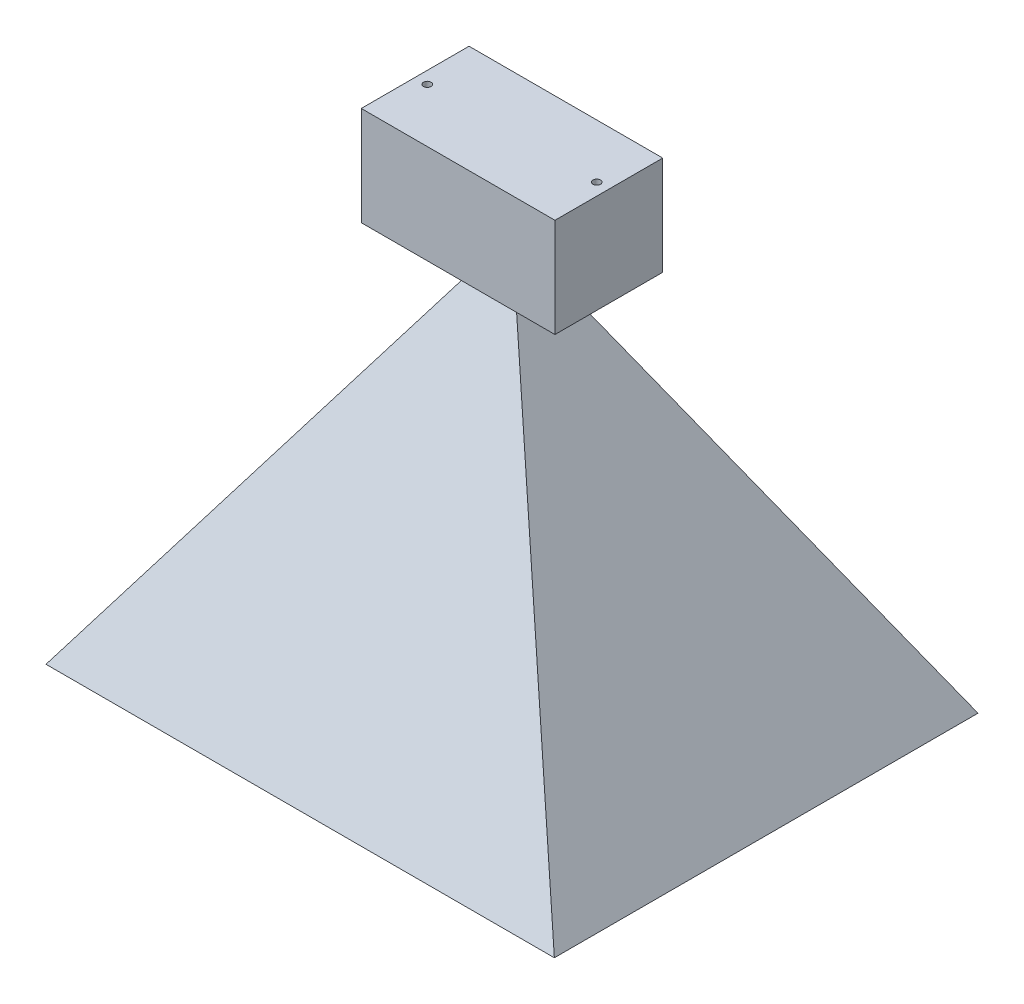
ISO-10303-21;
HEADER;
FILE_DESCRIPTION(('STEP AP214'),'2;1');
FILE_NAME('part.step','',(''),(''),'','','');
FILE_SCHEMA(('AUTOMOTIVE_DESIGN { 1 0 10303 214 1 1 1 1 }'));
ENDSEC;
DATA;
#1=APPLICATION_CONTEXT('core data for automotive mechanical design processes');
#2=APPLICATION_PROTOCOL_DEFINITION('international standard','automotive_design',2000,#1);
#3=PRODUCT_CONTEXT('',#1,'mechanical');
#4=PRODUCT('Part','Part','',(#3));
#5=PRODUCT_RELATED_PRODUCT_CATEGORY('part','',(#4));
#6=PRODUCT_DEFINITION_FORMATION('','',#4);
#7=PRODUCT_DEFINITION_CONTEXT('part definition',#1,'design');
#8=PRODUCT_DEFINITION('design','',#6,#7);
#9=PRODUCT_DEFINITION_SHAPE('','',#8);
#10=(LENGTH_UNIT() NAMED_UNIT(*) SI_UNIT(.MILLI.,.METRE.));
#11=(NAMED_UNIT(*) PLANE_ANGLE_UNIT() SI_UNIT($,.RADIAN.));
#12=(NAMED_UNIT(*) SI_UNIT($,.STERADIAN.) SOLID_ANGLE_UNIT());
#13=UNCERTAINTY_MEASURE_WITH_UNIT(LENGTH_MEASURE(1.E-05),#10,'distance_accuracy_value','');
#14=(GEOMETRIC_REPRESENTATION_CONTEXT(3) GLOBAL_UNCERTAINTY_ASSIGNED_CONTEXT((#13)) GLOBAL_UNIT_ASSIGNED_CONTEXT((#10,
#11,#12)) REPRESENTATION_CONTEXT('',''));
#15=CARTESIAN_POINT('',(0.,0.,0.));
#16=DIRECTION('',(0.,0.,1.));
#17=DIRECTION('',(1.,0.,0.));
#18=AXIS2_PLACEMENT_3D('',#15,#16,#17);
#19=CARTESIAN_POINT('',(0.,0.,0.));
#20=DIRECTION('',(0.,-1.,0.));
#21=DIRECTION('',(0.,0.,-1.));
#22=AXIS2_PLACEMENT_3D('',#19,#20,#21);
#23=PLANE('',#22);
#24=DIRECTION('',(0.,0.,-1.));
#25=VECTOR('',#24,1.);
#26=CARTESIAN_POINT('',(76.2000000000001,0.,63.5));
#27=LINE('',#26,#25);
#28=CARTESIAN_POINT('',(76.2000000000001,0.,63.5));
#29=VERTEX_POINT('',#28);
#30=CARTESIAN_POINT('',(76.2000000000001,0.,-63.5));
#31=VERTEX_POINT('',#30);
#32=EDGE_CURVE('E92',#29,#31,#27,.T.);
#33=ORIENTED_EDGE('',*,*,#32,.F.);
#34=DIRECTION('',(1.,0.,0.));
#35=VECTOR('',#34,1.);
#36=CARTESIAN_POINT('',(-76.1999999999999,0.,63.5));
#37=LINE('',#36,#35);
#38=CARTESIAN_POINT('',(-76.1999999999999,0.,63.5));
#39=VERTEX_POINT('',#38);
#40=EDGE_CURVE('E86',#39,#29,#37,.T.);
#41=ORIENTED_EDGE('',*,*,#40,.F.);
#42=DIRECTION('',(0.,0.,1.));
#43=VECTOR('',#42,1.);
#44=CARTESIAN_POINT('',(-76.1999999999999,0.,63.5));
#45=LINE('',#44,#43);
#46=CARTESIAN_POINT('',(-76.1999999999999,0.,-63.5));
#47=VERTEX_POINT('',#46);
#48=EDGE_CURVE('E103',#47,#39,#45,.T.);
#49=ORIENTED_EDGE('',*,*,#48,.F.);
#50=DIRECTION('',(-1.,0.,0.));
#51=VECTOR('',#50,1.);
#52=CARTESIAN_POINT('',(-76.1999999999999,0.,-63.5));
#53=LINE('',#52,#51);
#54=EDGE_CURVE('E109',#31,#47,#53,.T.);
#55=ORIENTED_EDGE('',*,*,#54,.F.);
#56=EDGE_LOOP('',(#33,#41,#49,#55));
#57=FACE_BOUND('',#56,.T.);
#58=ADVANCED_FACE('F45',(#57),#23,.T.);
#59=CARTESIAN_POINT('',(-53.811142369564,34.7097969663219,0.));
#60=DIRECTION('',(-0.840346934741353,0.542048917784007,0.));
#61=DIRECTION('',(-0.542048917784007,-0.840346934741353,0.));
#62=AXIS2_PLACEMENT_3D('',#59,#60,#61);
#63=PLANE('',#62);
#64=DIRECTION('',(-0.493989929674284,-0.765840332071832,-0.41165827472857));
#65=VECTOR('',#64,1.);
#66=CARTESIAN_POINT('',(-2.47307991337973,114.3,-2.06089992781642));
#67=LINE('',#66,#65);
#68=CARTESIAN_POINT('',(-2.47307991337973,114.3,-2.06089992781642));
#69=VERTEX_POINT('',#68);
#70=EDGE_CURVE('E163',#69,#47,#67,.T.);
#71=ORIENTED_EDGE('',*,*,#70,.T.);
#72=ORIENTED_EDGE('',*,*,#48,.T.);
#73=DIRECTION('',(-0.493989929674284,-0.765840332071832,0.41165827472857));
#74=VECTOR('',#73,1.);
#75=CARTESIAN_POINT('',(-2.47307991337973,114.3,2.06089992781653));
#76=LINE('',#75,#74);
#77=CARTESIAN_POINT('',(-2.47307991337973,114.3,2.06089992781653));
#78=VERTEX_POINT('',#77);
#79=EDGE_CURVE('E102',#78,#39,#76,.T.);
#80=ORIENTED_EDGE('',*,*,#79,.F.);
#81=DIRECTION('',(0.,0.,1.));
#82=VECTOR('',#81,1.);
#83=CARTESIAN_POINT('',(-2.47307991337973,114.3,2.06089992781653));
#84=LINE('',#83,#82);
#85=EDGE_CURVE('E56',#69,#78,#84,.T.);
#86=ORIENTED_EDGE('',*,*,#85,.F.);
#87=EDGE_LOOP('',(#71,#72,#80,#86));
#88=FACE_BOUND('',#87,.T.);
#89=ADVANCED_FACE('F167',(#88),#63,.T.);
#90=CARTESIAN_POINT('',(0.,26.4814632698211,49.2655531767945));
#91=DIRECTION('',(0.,0.473460153445751,0.880815237776417));
#92=DIRECTION('',(0.,-0.880815237776417,0.473460153445751));
#93=AXIS2_PLACEMENT_3D('',#90,#91,#92);
#94=PLANE('',#93);
#95=ORIENTED_EDGE('',*,*,#79,.T.);
#96=ORIENTED_EDGE('',*,*,#40,.T.);
#97=DIRECTION('',(0.493989929674284,-0.765840332071832,0.411658274728569));
#98=VECTOR('',#97,1.);
#99=CARTESIAN_POINT('',(2.47307991337981,114.3,2.06089992781653));
#100=LINE('',#99,#98);
#101=CARTESIAN_POINT('',(2.47307991337981,114.3,2.06089992781653));
#102=VERTEX_POINT('',#101);
#103=EDGE_CURVE('E90',#102,#29,#100,.T.);
#104=ORIENTED_EDGE('',*,*,#103,.F.);
#105=DIRECTION('',(1.,0.,0.));
#106=VECTOR('',#105,1.);
#107=CARTESIAN_POINT('',(-2.47307991337973,114.3,2.06089992781653));
#108=LINE('',#107,#106);
#109=EDGE_CURVE('E12',#78,#102,#108,.T.);
#110=ORIENTED_EDGE('',*,*,#109,.F.);
#111=EDGE_LOOP('',(#95,#96,#104,#110));
#112=FACE_BOUND('',#111,.T.);
#113=ADVANCED_FACE('F101',(#112),#94,.T.);
#114=CARTESIAN_POINT('',(0.,26.4814632698211,-49.2655531767944));
#115=DIRECTION('',(0.,0.473460153445752,-0.880815237776416));
#116=DIRECTION('',(0.,0.880815237776416,0.473460153445752));
#117=AXIS2_PLACEMENT_3D('',#114,#115,#116);
#118=PLANE('',#117);
#119=DIRECTION('',(0.493989929674284,-0.765840332071831,-0.41165827472857));
#120=VECTOR('',#119,1.);
#121=CARTESIAN_POINT('',(2.47307991337981,114.3,-2.06089992781642));
#122=LINE('',#121,#120);
#123=CARTESIAN_POINT('',(2.47307991337982,114.3,-2.06089992781642));
#124=VERTEX_POINT('',#123);
#125=EDGE_CURVE('E97',#124,#31,#122,.T.);
#126=ORIENTED_EDGE('',*,*,#125,.T.);
#127=ORIENTED_EDGE('',*,*,#54,.T.);
#128=ORIENTED_EDGE('',*,*,#70,.F.);
#129=DIRECTION('',(-1.,0.,0.));
#130=VECTOR('',#129,1.);
#131=CARTESIAN_POINT('',(-2.47307991337973,114.3,-2.06089992781642));
#132=LINE('',#131,#130);
#133=EDGE_CURVE('E49',#124,#69,#132,.T.);
#134=ORIENTED_EDGE('',*,*,#133,.F.);
#135=EDGE_LOOP('',(#126,#127,#128,#134));
#136=FACE_BOUND('',#135,.T.);
#137=ADVANCED_FACE('F161',(#136),#118,.T.);
#138=CARTESIAN_POINT('',(53.8111423695641,34.709796966322,0.));
#139=DIRECTION('',(0.840346934741352,0.542048917784007,0.));
#140=DIRECTION('',(-0.542048917784007,0.840346934741352,0.));
#141=AXIS2_PLACEMENT_3D('',#138,#139,#140);
#142=PLANE('',#141);
#143=ORIENTED_EDGE('',*,*,#103,.T.);
#144=ORIENTED_EDGE('',*,*,#32,.T.);
#145=ORIENTED_EDGE('',*,*,#125,.F.);
#146=DIRECTION('',(0.,0.,-1.));
#147=VECTOR('',#146,1.);
#148=CARTESIAN_POINT('',(2.47307991337981,114.3,2.06089992781653));
#149=LINE('',#148,#147);
#150=EDGE_CURVE('E65',#102,#124,#149,.T.);
#151=ORIENTED_EDGE('',*,*,#150,.F.);
#152=EDGE_LOOP('',(#143,#144,#145,#151));
#153=FACE_BOUND('',#152,.T.);
#154=ADVANCED_FACE('F91',(#153),#142,.T.);
#155=CARTESIAN_POINT('',(0.,114.554,0.));
#156=DIRECTION('',(0.,-1.,0.));
#157=DIRECTION('',(0.,0.,-1.));
#158=AXIS2_PLACEMENT_3D('',#155,#156,#157);
#159=CYLINDRICAL_SURFACE('',#158,8.509);
#160=CARTESIAN_POINT('',(0.,114.554,0.));
#161=DIRECTION('',(0.,1.,0.));
#162=DIRECTION('',(0.,0.,1.));
#163=AXIS2_PLACEMENT_3D('',#160,#161,#162);
#164=CIRCLE('',#163,8.509);
#165=CARTESIAN_POINT('',(0.,114.554,8.509));
#166=VERTEX_POINT('',#165);
#167=EDGE_CURVE('E111',#166,#166,#164,.T.);
#168=ORIENTED_EDGE('',*,*,#167,.F.);
#169=EDGE_LOOP('',(#168));
#170=FACE_BOUND('',#169,.T.);
#171=CARTESIAN_POINT('',(0.,114.3,0.));
#172=DIRECTION('',(0.,1.,0.));
#173=DIRECTION('',(0.,0.,1.));
#174=AXIS2_PLACEMENT_3D('',#171,#172,#173);
#175=CIRCLE('',#174,8.509);
#176=CARTESIAN_POINT('',(0.,114.3,8.509));
#177=VERTEX_POINT('',#176);
#178=EDGE_CURVE('E293',#177,#177,#175,.T.);
#179=ORIENTED_EDGE('',*,*,#178,.T.);
#180=EDGE_LOOP('',(#179));
#181=FACE_BOUND('',#180,.T.);
#182=ADVANCED_FACE('F213',(#170,#181),#159,.T.);
#183=CARTESIAN_POINT('',(0.,114.3,0.));
#184=DIRECTION('',(0.,1.,0.));
#185=DIRECTION('',(0.,0.,1.));
#186=AXIS2_PLACEMENT_3D('',#183,#184,#185);
#187=PLANE('',#186);
#188=ORIENTED_EDGE('',*,*,#85,.T.);
#189=ORIENTED_EDGE('',*,*,#109,.T.);
#190=ORIENTED_EDGE('',*,*,#150,.T.);
#191=ORIENTED_EDGE('',*,*,#133,.T.);
#192=EDGE_LOOP('',(#188,#189,#190,#191));
#193=FACE_BOUND('',#192,.T.);
#194=ORIENTED_EDGE('',*,*,#178,.F.);
#195=EDGE_LOOP('',(#194));
#196=FACE_BOUND('',#195,.T.);
#197=ADVANCED_FACE('F226',(#193,#196),#187,.F.);
#198=CARTESIAN_POINT('',(0.,114.554,0.));
#199=DIRECTION('',(0.,1.,0.));
#200=DIRECTION('',(0.,0.,1.));
#201=AXIS2_PLACEMENT_3D('',#198,#199,#200);
#202=PLANE('',#201);
#203=CARTESIAN_POINT('',(-25.4,114.554,0.));
#204=DIRECTION('',(0.,1.,0.));
#205=DIRECTION('',(0.,0.,1.));
#206=AXIS2_PLACEMENT_3D('',#203,#204,#205);
#207=CIRCLE('',#206,1.13029999999999);
#208=CARTESIAN_POINT('',(-25.4,114.554,1.13029999999999));
#209=VERTEX_POINT('',#208);
#210=EDGE_CURVE('E340',#209,#209,#207,.T.);
#211=ORIENTED_EDGE('',*,*,#210,.T.);
#212=EDGE_LOOP('',(#211));
#213=FACE_BOUND('',#212,.T.);
#214=CARTESIAN_POINT('',(25.4,114.554,0.));
#215=DIRECTION('',(0.,1.,0.));
#216=DIRECTION('',(0.,0.,1.));
#217=AXIS2_PLACEMENT_3D('',#214,#215,#216);
#218=CIRCLE('',#217,1.13029999999999);
#219=CARTESIAN_POINT('',(25.4,114.554,1.13029999999999));
#220=VERTEX_POINT('',#219);
#221=EDGE_CURVE('E324',#220,#220,#218,.T.);
#222=ORIENTED_EDGE('',*,*,#221,.T.);
#223=EDGE_LOOP('',(#222));
#224=FACE_BOUND('',#223,.T.);
#225=DIRECTION('',(0.,0.,1.));
#226=VECTOR('',#225,1.);
#227=CARTESIAN_POINT('',(-29.0322,114.554,16.1544));
#228=LINE('',#227,#226);
#229=CARTESIAN_POINT('',(-29.0322,114.554,-16.1544));
#230=VERTEX_POINT('',#229);
#231=CARTESIAN_POINT('',(-29.0322,114.554,16.1544));
#232=VERTEX_POINT('',#231);
#233=EDGE_CURVE('E321',#230,#232,#228,.T.);
#234=ORIENTED_EDGE('',*,*,#233,.F.);
#235=DIRECTION('',(-1.,0.,0.));
#236=VECTOR('',#235,1.);
#237=CARTESIAN_POINT('',(29.0322,114.554,-16.1544));
#238=LINE('',#237,#236);
#239=CARTESIAN_POINT('',(29.0322,114.554,-16.1544));
#240=VERTEX_POINT('',#239);
#241=EDGE_CURVE('E311',#240,#230,#238,.T.);
#242=ORIENTED_EDGE('',*,*,#241,.F.);
#243=DIRECTION('',(0.,0.,-1.));
#244=VECTOR('',#243,1.);
#245=CARTESIAN_POINT('',(29.0322,114.554,16.1544));
#246=LINE('',#245,#244);
#247=CARTESIAN_POINT('',(29.0322,114.554,16.1544));
#248=VERTEX_POINT('',#247);
#249=EDGE_CURVE('E315',#248,#240,#246,.T.);
#250=ORIENTED_EDGE('',*,*,#249,.F.);
#251=DIRECTION('',(1.,0.,0.));
#252=VECTOR('',#251,1.);
#253=CARTESIAN_POINT('',(29.0322,114.554,16.1544));
#254=LINE('',#253,#252);
#255=EDGE_CURVE('E318',#232,#248,#254,.T.);
#256=ORIENTED_EDGE('',*,*,#255,.F.);
#257=EDGE_LOOP('',(#234,#242,#250,#256));
#258=FACE_BOUND('',#257,.T.);
#259=ORIENTED_EDGE('',*,*,#167,.T.);
#260=EDGE_LOOP('',(#259));
#261=FACE_BOUND('',#260,.T.);
#262=ADVANCED_FACE('F256',(#213,#224,#258,#261),#202,.F.);
#263=CARTESIAN_POINT('',(-29.0322,144.2212,16.1544));
#264=DIRECTION('',(1.,0.,0.));
#265=DIRECTION('',(0.,0.,-1.));
#266=AXIS2_PLACEMENT_3D('',#263,#264,#265);
#267=PLANE('',#266);
#268=ORIENTED_EDGE('',*,*,#233,.T.);
#269=DIRECTION('',(0.,-1.,0.));
#270=VECTOR('',#269,1.);
#271=CARTESIAN_POINT('',(-29.0322,144.2212,16.1544));
#272=LINE('',#271,#270);
#273=CARTESIAN_POINT('',(-29.0322,144.2212,16.1544));
#274=VERTEX_POINT('',#273);
#275=EDGE_CURVE('E296',#274,#232,#272,.T.);
#276=ORIENTED_EDGE('',*,*,#275,.F.);
#277=DIRECTION('',(0.,0.,1.));
#278=VECTOR('',#277,1.);
#279=CARTESIAN_POINT('',(-29.0322,144.2212,16.1544));
#280=LINE('',#279,#278);
#281=CARTESIAN_POINT('',(-29.0322,144.2212,-16.1544));
#282=VERTEX_POINT('',#281);
#283=EDGE_CURVE('E314',#282,#274,#280,.T.);
#284=ORIENTED_EDGE('',*,*,#283,.F.);
#285=DIRECTION('',(0.,-1.,0.));
#286=VECTOR('',#285,1.);
#287=CARTESIAN_POINT('',(-29.0322,144.2212,-16.1544));
#288=LINE('',#287,#286);
#289=EDGE_CURVE('E307',#282,#230,#288,.T.);
#290=ORIENTED_EDGE('',*,*,#289,.T.);
#291=EDGE_LOOP('',(#268,#276,#284,#290));
#292=FACE_BOUND('',#291,.T.);
#293=ADVANCED_FACE('F258',(#292),#267,.F.);
#294=CARTESIAN_POINT('',(29.0322,144.2212,16.1544));
#295=DIRECTION('',(0.,0.,-1.));
#296=DIRECTION('',(-1.,0.,0.));
#297=AXIS2_PLACEMENT_3D('',#294,#295,#296);
#298=PLANE('',#297);
#299=ORIENTED_EDGE('',*,*,#255,.T.);
#300=DIRECTION('',(0.,-1.,0.));
#301=VECTOR('',#300,1.);
#302=CARTESIAN_POINT('',(29.0322,144.2212,16.1544));
#303=LINE('',#302,#301);
#304=CARTESIAN_POINT('',(29.0322,144.2212,16.1544));
#305=VERTEX_POINT('',#304);
#306=EDGE_CURVE('E301',#305,#248,#303,.T.);
#307=ORIENTED_EDGE('',*,*,#306,.F.);
#308=DIRECTION('',(1.,0.,0.));
#309=VECTOR('',#308,1.);
#310=CARTESIAN_POINT('',(29.0322,144.2212,16.1544));
#311=LINE('',#310,#309);
#312=EDGE_CURVE('E330',#274,#305,#311,.T.);
#313=ORIENTED_EDGE('',*,*,#312,.F.);
#314=ORIENTED_EDGE('',*,*,#275,.T.);
#315=EDGE_LOOP('',(#299,#307,#313,#314));
#316=FACE_BOUND('',#315,.T.);
#317=ADVANCED_FACE('F371',(#316),#298,.F.);
#318=CARTESIAN_POINT('',(29.0322,144.2212,16.1544));
#319=DIRECTION('',(-1.,0.,0.));
#320=DIRECTION('',(0.,0.,1.));
#321=AXIS2_PLACEMENT_3D('',#318,#319,#320);
#322=PLANE('',#321);
#323=ORIENTED_EDGE('',*,*,#249,.T.);
#324=DIRECTION('',(0.,-1.,0.));
#325=VECTOR('',#324,1.);
#326=CARTESIAN_POINT('',(29.0322,144.2212,-16.1544));
#327=LINE('',#326,#325);
#328=CARTESIAN_POINT('',(29.0322,144.2212,-16.1544));
#329=VERTEX_POINT('',#328);
#330=EDGE_CURVE('E304',#329,#240,#327,.T.);
#331=ORIENTED_EDGE('',*,*,#330,.F.);
#332=DIRECTION('',(0.,0.,-1.));
#333=VECTOR('',#332,1.);
#334=CARTESIAN_POINT('',(29.0322,144.2212,16.1544));
#335=LINE('',#334,#333);
#336=EDGE_CURVE('E327',#305,#329,#335,.T.);
#337=ORIENTED_EDGE('',*,*,#336,.F.);
#338=ORIENTED_EDGE('',*,*,#306,.T.);
#339=EDGE_LOOP('',(#323,#331,#337,#338));
#340=FACE_BOUND('',#339,.T.);
#341=ADVANCED_FACE('F401',(#340),#322,.F.);
#342=CARTESIAN_POINT('',(29.0322,144.2212,-16.1544));
#343=DIRECTION('',(0.,0.,1.));
#344=DIRECTION('',(1.,0.,0.));
#345=AXIS2_PLACEMENT_3D('',#342,#343,#344);
#346=PLANE('',#345);
#347=ORIENTED_EDGE('',*,*,#241,.T.);
#348=ORIENTED_EDGE('',*,*,#289,.F.);
#349=DIRECTION('',(-1.,0.,0.));
#350=VECTOR('',#349,1.);
#351=CARTESIAN_POINT('',(29.0322,144.2212,-16.1544));
#352=LINE('',#351,#350);
#353=EDGE_CURVE('E310',#329,#282,#352,.T.);
#354=ORIENTED_EDGE('',*,*,#353,.F.);
#355=ORIENTED_EDGE('',*,*,#330,.T.);
#356=EDGE_LOOP('',(#347,#348,#354,#355));
#357=FACE_BOUND('',#356,.T.);
#358=ADVANCED_FACE('F353',(#357),#346,.F.);
#359=CARTESIAN_POINT('',(0.,144.2212,0.));
#360=DIRECTION('',(0.,1.,0.));
#361=DIRECTION('',(0.,0.,1.));
#362=AXIS2_PLACEMENT_3D('',#359,#360,#361);
#363=PLANE('',#362);
#364=CARTESIAN_POINT('',(-25.4,144.2212,0.));
#365=DIRECTION('',(0.,1.,0.));
#366=DIRECTION('',(0.,0.,1.));
#367=AXIS2_PLACEMENT_3D('',#364,#365,#366);
#368=CIRCLE('',#367,1.13029999999999);
#369=CARTESIAN_POINT('',(-25.4,144.2212,1.13029999999999));
#370=VERTEX_POINT('',#369);
#371=EDGE_CURVE('E343',#370,#370,#368,.T.);
#372=ORIENTED_EDGE('',*,*,#371,.F.);
#373=EDGE_LOOP('',(#372));
#374=FACE_BOUND('',#373,.T.);
#375=CARTESIAN_POINT('',(25.4,144.2212,0.));
#376=DIRECTION('',(0.,1.,0.));
#377=DIRECTION('',(0.,0.,1.));
#378=AXIS2_PLACEMENT_3D('',#375,#376,#377);
#379=CIRCLE('',#378,1.13029999999999);
#380=CARTESIAN_POINT('',(25.4,144.2212,1.13029999999999));
#381=VERTEX_POINT('',#380);
#382=EDGE_CURVE('E337',#381,#381,#379,.T.);
#383=ORIENTED_EDGE('',*,*,#382,.F.);
#384=EDGE_LOOP('',(#383));
#385=FACE_BOUND('',#384,.T.);
#386=ORIENTED_EDGE('',*,*,#283,.T.);
#387=ORIENTED_EDGE('',*,*,#312,.T.);
#388=ORIENTED_EDGE('',*,*,#336,.T.);
#389=ORIENTED_EDGE('',*,*,#353,.T.);
#390=EDGE_LOOP('',(#386,#387,#388,#389));
#391=FACE_BOUND('',#390,.T.);
#392=ADVANCED_FACE('F349',(#374,#385,#391),#363,.T.);
#393=CARTESIAN_POINT('',(25.4,144.2212,0.));
#394=DIRECTION('',(0.,1.,0.));
#395=DIRECTION('',(0.,0.,1.));
#396=AXIS2_PLACEMENT_3D('',#393,#394,#395);
#397=CYLINDRICAL_SURFACE('',#396,1.13029999999999);
#398=ORIENTED_EDGE('',*,*,#221,.F.);
#399=EDGE_LOOP('',(#398));
#400=FACE_BOUND('',#399,.T.);
#401=ORIENTED_EDGE('',*,*,#382,.T.);
#402=EDGE_LOOP('',(#401));
#403=FACE_BOUND('',#402,.T.);
#404=ADVANCED_FACE('F352',(#400,#403),#397,.F.);
#405=CARTESIAN_POINT('',(-25.4,144.2212,0.));
#406=DIRECTION('',(0.,1.,0.));
#407=DIRECTION('',(0.,0.,1.));
#408=AXIS2_PLACEMENT_3D('',#405,#406,#407);
#409=CYLINDRICAL_SURFACE('',#408,1.13029999999999);
#410=ORIENTED_EDGE('',*,*,#210,.F.);
#411=EDGE_LOOP('',(#410));
#412=FACE_BOUND('',#411,.T.);
#413=ORIENTED_EDGE('',*,*,#371,.T.);
#414=EDGE_LOOP('',(#413));
#415=FACE_BOUND('',#414,.T.);
#416=ADVANCED_FACE('F347',(#412,#415),#409,.F.);
#417=CLOSED_SHELL('',(#58,#89,#113,#137,#154,#182,#197,#262,#293,#317,#341,#358,#392,#404,#416));
#418=MANIFOLD_SOLID_BREP('B2',#417);
#419=ADVANCED_BREP_SHAPE_REPRESENTATION('',(#18,#418),#14);
#420=SHAPE_DEFINITION_REPRESENTATION(#9,#419);
ENDSEC;
END-ISO-10303-21;
